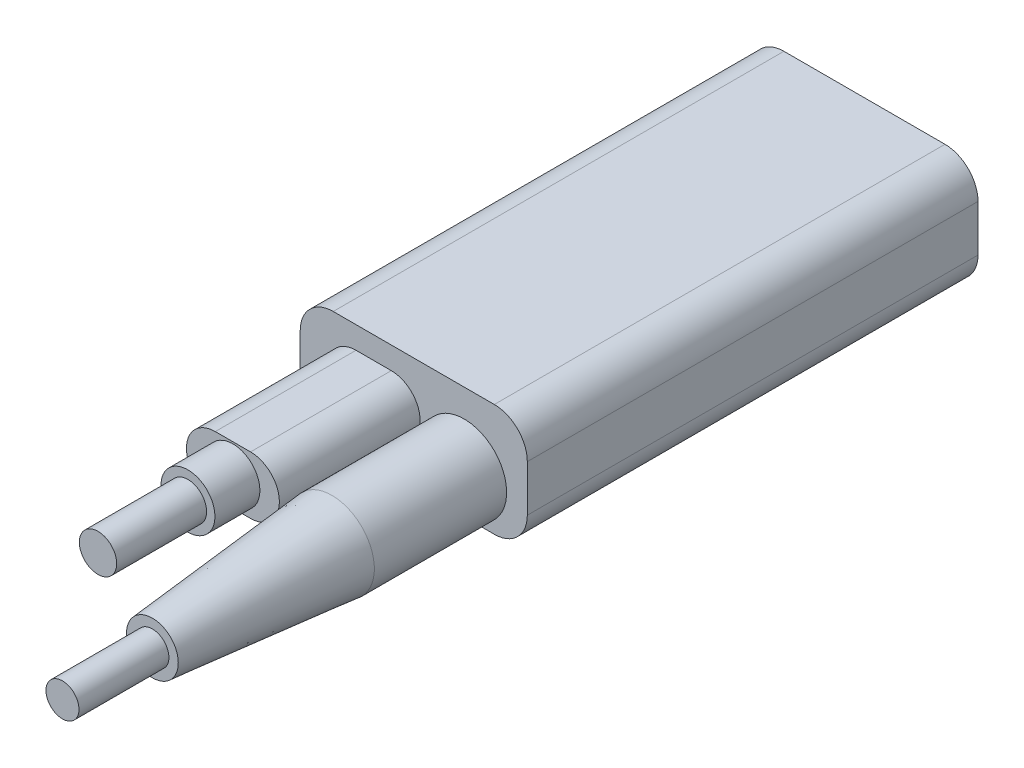
ISO-10303-21;
HEADER;
FILE_DESCRIPTION(('STEP AP214'),'2;1');
FILE_NAME('part.step','',(''),(''),'','','');
FILE_SCHEMA(('AUTOMOTIVE_DESIGN { 1 0 10303 214 1 1 1 1 }'));
ENDSEC;
DATA;
#1=APPLICATION_CONTEXT('core data for automotive mechanical design processes');
#2=APPLICATION_PROTOCOL_DEFINITION('international standard','automotive_design',2000,#1);
#3=PRODUCT_CONTEXT('',#1,'mechanical');
#4=PRODUCT('Part','Part','',(#3));
#5=PRODUCT_RELATED_PRODUCT_CATEGORY('part','',(#4));
#6=PRODUCT_DEFINITION_FORMATION('','',#4);
#7=PRODUCT_DEFINITION_CONTEXT('part definition',#1,'design');
#8=PRODUCT_DEFINITION('design','',#6,#7);
#9=PRODUCT_DEFINITION_SHAPE('','',#8);
#10=(LENGTH_UNIT() NAMED_UNIT(*) SI_UNIT(.MILLI.,.METRE.));
#11=(NAMED_UNIT(*) PLANE_ANGLE_UNIT() SI_UNIT($,.RADIAN.));
#12=(NAMED_UNIT(*) SI_UNIT($,.STERADIAN.) SOLID_ANGLE_UNIT());
#13=UNCERTAINTY_MEASURE_WITH_UNIT(LENGTH_MEASURE(1.E-05),#10,'distance_accuracy_value','');
#14=(GEOMETRIC_REPRESENTATION_CONTEXT(3) GLOBAL_UNCERTAINTY_ASSIGNED_CONTEXT((#13)) GLOBAL_UNIT_ASSIGNED_CONTEXT((#10,
#11,#12)) REPRESENTATION_CONTEXT('',''));
#15=CARTESIAN_POINT('',(0.,0.,0.));
#16=DIRECTION('',(0.,0.,1.));
#17=DIRECTION('',(1.,0.,0.));
#18=AXIS2_PLACEMENT_3D('',#15,#16,#17);
#19=CARTESIAN_POINT('',(0.,0.,25.055));
#20=DIRECTION('',(0.,0.,-1.));
#21=DIRECTION('',(-1.,0.,0.));
#22=AXIS2_PLACEMENT_3D('',#19,#20,#21);
#23=PLANE('',#22);
#24=DIRECTION('',(1.,0.,0.));
#25=VECTOR('',#24,1.);
#26=CARTESIAN_POINT('',(-12.625,-6.25,25.055));
#27=LINE('',#26,#25);
#28=CARTESIAN_POINT('',(5.61,-6.25,25.055));
#29=VERTEX_POINT('',#28);
#30=CARTESIAN_POINT('',(8.95500000000001,-6.25,25.055));
#31=VERTEX_POINT('',#30);
#32=EDGE_CURVE('E178',#29,#31,#27,.T.);
#33=ORIENTED_EDGE('',*,*,#32,.T.);
#34=CARTESIAN_POINT('',(8.95500000000001,-2.58,25.055));
#35=DIRECTION('',(0.,0.,-1.));
#36=DIRECTION('',(-1.,0.,0.));
#37=AXIS2_PLACEMENT_3D('',#34,#35,#36);
#38=CIRCLE('',#37,3.67);
#39=CARTESIAN_POINT('',(12.625,-2.58,25.055));
#40=VERTEX_POINT('',#39);
#41=EDGE_CURVE('E229',#31,#40,#38,.F.);
#42=ORIENTED_EDGE('',*,*,#41,.T.);
#43=DIRECTION('',(0.,1.,0.));
#44=VECTOR('',#43,1.);
#45=CARTESIAN_POINT('',(12.625,-6.25,25.055));
#46=LINE('',#45,#44);
#47=CARTESIAN_POINT('',(12.625,2.58,25.055));
#48=VERTEX_POINT('',#47);
#49=EDGE_CURVE('E201',#40,#48,#46,.T.);
#50=ORIENTED_EDGE('',*,*,#49,.T.);
#51=CARTESIAN_POINT('',(8.955,2.58,25.055));
#52=DIRECTION('',(0.,0.,-1.));
#53=DIRECTION('',(-1.,0.,0.));
#54=AXIS2_PLACEMENT_3D('',#51,#52,#53);
#55=CIRCLE('',#54,3.67);
#56=CARTESIAN_POINT('',(8.955,6.25,25.055));
#57=VERTEX_POINT('',#56);
#58=EDGE_CURVE('E227',#48,#57,#55,.F.);
#59=ORIENTED_EDGE('',*,*,#58,.T.);
#60=DIRECTION('',(-1.,0.,0.));
#61=VECTOR('',#60,1.);
#62=CARTESIAN_POINT('',(-12.625,6.25,25.055));
#63=LINE('',#62,#61);
#64=CARTESIAN_POINT('',(-8.955,6.25,25.055));
#65=VERTEX_POINT('',#64);
#66=EDGE_CURVE('E186',#57,#65,#63,.T.);
#67=ORIENTED_EDGE('',*,*,#66,.T.);
#68=CARTESIAN_POINT('',(-8.955,2.58,25.055));
#69=DIRECTION('',(0.,0.,-1.));
#70=DIRECTION('',(-1.,0.,0.));
#71=AXIS2_PLACEMENT_3D('',#68,#69,#70);
#72=CIRCLE('',#71,3.67);
#73=CARTESIAN_POINT('',(-12.625,2.58,25.055));
#74=VERTEX_POINT('',#73);
#75=EDGE_CURVE('E71',#65,#74,#72,.F.);
#76=ORIENTED_EDGE('',*,*,#75,.T.);
#77=DIRECTION('',(0.,-1.,0.));
#78=VECTOR('',#77,1.);
#79=CARTESIAN_POINT('',(-12.625,-6.25,25.055));
#80=LINE('',#79,#78);
#81=CARTESIAN_POINT('',(-12.625,-2.58,25.055));
#82=VERTEX_POINT('',#81);
#83=EDGE_CURVE('E185',#74,#82,#80,.T.);
#84=ORIENTED_EDGE('',*,*,#83,.T.);
#85=CARTESIAN_POINT('',(-8.955,-2.58,25.055));
#86=DIRECTION('',(0.,0.,-1.));
#87=DIRECTION('',(-1.,0.,0.));
#88=AXIS2_PLACEMENT_3D('',#85,#86,#87);
#89=CIRCLE('',#88,3.67);
#90=CARTESIAN_POINT('',(-8.955,-6.25,25.055));
#91=VERTEX_POINT('',#90);
#92=EDGE_CURVE('E173',#82,#91,#89,.F.);
#93=ORIENTED_EDGE('',*,*,#92,.T.);
#94=EDGE_CURVE('E166',#91,#29,#27,.T.);
#95=ORIENTED_EDGE('',*,*,#94,.T.);
#96=CARTESIAN_POINT('',(5.61,-1.535,25.055));
#97=DIRECTION('',(0.,0.,1.));
#98=DIRECTION('',(1.,0.,0.));
#99=AXIS2_PLACEMENT_3D('',#96,#97,#98);
#100=CIRCLE('',#99,4.715);
#101=EDGE_CURVE('E171',#29,#29,#100,.T.);
#102=ORIENTED_EDGE('',*,*,#101,.F.);
#103=EDGE_LOOP('',(#33,#42,#50,#59,#67,#76,#84,#93,#95,#102));
#104=FACE_BOUND('',#103,.T.);
#105=CARTESIAN_POINT('',(-6.42,0.575,25.055));
#106=DIRECTION('',(0.,0.,1.));
#107=DIRECTION('',(1.,0.,0.));
#108=AXIS2_PLACEMENT_3D('',#105,#106,#107);
#109=CIRCLE('',#108,3.205);
#110=CARTESIAN_POINT('',(-6.42,3.78,25.055));
#111=VERTEX_POINT('',#110);
#112=CARTESIAN_POINT('',(-6.42,-2.63,25.055));
#113=VERTEX_POINT('',#112);
#114=EDGE_CURVE('E205',#111,#113,#109,.T.);
#115=ORIENTED_EDGE('',*,*,#114,.F.);
#116=DIRECTION('',(-1.,0.,0.));
#117=VECTOR('',#116,1.);
#118=CARTESIAN_POINT('',(-6.42,3.78,25.055));
#119=LINE('',#118,#117);
#120=CARTESIAN_POINT('',(-2.5,3.78,25.055));
#121=VERTEX_POINT('',#120);
#122=EDGE_CURVE('E302',#121,#111,#119,.T.);
#123=ORIENTED_EDGE('',*,*,#122,.F.);
#124=CARTESIAN_POINT('',(-2.5,0.575,25.055));
#125=DIRECTION('',(0.,0.,1.));
#126=DIRECTION('',(1.,0.,0.));
#127=AXIS2_PLACEMENT_3D('',#124,#125,#126);
#128=CIRCLE('',#127,3.205);
#129=CARTESIAN_POINT('',(-2.5,-2.63,25.055));
#130=VERTEX_POINT('',#129);
#131=EDGE_CURVE('E306',#130,#121,#128,.T.);
#132=ORIENTED_EDGE('',*,*,#131,.F.);
#133=DIRECTION('',(1.,0.,0.));
#134=VECTOR('',#133,1.);
#135=CARTESIAN_POINT('',(-6.42,-2.63,25.055));
#136=LINE('',#135,#134);
#137=EDGE_CURVE('E309',#113,#130,#136,.T.);
#138=ORIENTED_EDGE('',*,*,#137,.F.);
#139=EDGE_LOOP('',(#115,#123,#132,#138));
#140=FACE_BOUND('',#139,.T.);
#141=ADVANCED_FACE('F51',(#104,#140),#23,.F.);
#142=CARTESIAN_POINT('',(12.625,-6.25,25.055));
#143=DIRECTION('',(-1.,0.,0.));
#144=DIRECTION('',(0.,0.,1.));
#145=AXIS2_PLACEMENT_3D('',#142,#143,#144);
#146=PLANE('',#145);
#147=ORIENTED_EDGE('',*,*,#49,.F.);
#148=DIRECTION('',(0.,0.,-1.));
#149=VECTOR('',#148,1.);
#150=CARTESIAN_POINT('',(12.625,-2.58,25.055));
#151=LINE('',#150,#149);
#152=CARTESIAN_POINT('',(12.625,-2.58,-25.055));
#153=VERTEX_POINT('',#152);
#154=EDGE_CURVE('E210',#40,#153,#151,.T.);
#155=ORIENTED_EDGE('',*,*,#154,.T.);
#156=DIRECTION('',(0.,1.,0.));
#157=VECTOR('',#156,1.);
#158=CARTESIAN_POINT('',(12.625,-6.25,-25.055));
#159=LINE('',#158,#157);
#160=CARTESIAN_POINT('',(12.625,2.58,-25.055));
#161=VERTEX_POINT('',#160);
#162=EDGE_CURVE('E190',#153,#161,#159,.T.);
#163=ORIENTED_EDGE('',*,*,#162,.T.);
#164=DIRECTION('',(0.,0.,-1.));
#165=VECTOR('',#164,1.);
#166=CARTESIAN_POINT('',(12.625,2.58,25.055));
#167=LINE('',#166,#165);
#168=EDGE_CURVE('E208',#161,#48,#167,.F.);
#169=ORIENTED_EDGE('',*,*,#168,.T.);
#170=EDGE_LOOP('',(#147,#155,#163,#169));
#171=FACE_BOUND('',#170,.T.);
#172=ADVANCED_FACE('F254',(#171),#146,.F.);
#173=CARTESIAN_POINT('',(-12.625,6.25,25.055));
#174=DIRECTION('',(0.,-1.,0.));
#175=DIRECTION('',(0.,0.,-1.));
#176=AXIS2_PLACEMENT_3D('',#173,#174,#175);
#177=PLANE('',#176);
#178=ORIENTED_EDGE('',*,*,#66,.F.);
#179=DIRECTION('',(0.,0.,-1.));
#180=VECTOR('',#179,1.);
#181=CARTESIAN_POINT('',(8.955,6.25,25.055));
#182=LINE('',#181,#180);
#183=CARTESIAN_POINT('',(8.955,6.25,-25.055));
#184=VERTEX_POINT('',#183);
#185=EDGE_CURVE('E233',#57,#184,#182,.T.);
#186=ORIENTED_EDGE('',*,*,#185,.T.);
#187=DIRECTION('',(-1.,0.,0.));
#188=VECTOR('',#187,1.);
#189=CARTESIAN_POINT('',(-12.625,6.25,-25.055));
#190=LINE('',#189,#188);
#191=CARTESIAN_POINT('',(-8.955,6.25,-25.055));
#192=VERTEX_POINT('',#191);
#193=EDGE_CURVE('E193',#184,#192,#190,.T.);
#194=ORIENTED_EDGE('',*,*,#193,.T.);
#195=DIRECTION('',(0.,0.,-1.));
#196=VECTOR('',#195,1.);
#197=CARTESIAN_POINT('',(-8.955,6.25,25.055));
#198=LINE('',#197,#196);
#199=EDGE_CURVE('E231',#192,#65,#198,.F.);
#200=ORIENTED_EDGE('',*,*,#199,.T.);
#201=EDGE_LOOP('',(#178,#186,#194,#200));
#202=FACE_BOUND('',#201,.T.);
#203=ADVANCED_FACE('F424',(#202),#177,.F.);
#204=CARTESIAN_POINT('',(-12.625,-6.25,25.055));
#205=DIRECTION('',(1.,0.,0.));
#206=DIRECTION('',(0.,0.,-1.));
#207=AXIS2_PLACEMENT_3D('',#204,#205,#206);
#208=PLANE('',#207);
#209=DIRECTION('',(0.,-1.,0.));
#210=VECTOR('',#209,1.);
#211=CARTESIAN_POINT('',(-12.625,-6.25,-25.055));
#212=LINE('',#211,#210);
#213=CARTESIAN_POINT('',(-12.625,2.58,-25.055));
#214=VERTEX_POINT('',#213);
#215=CARTESIAN_POINT('',(-12.625,-2.58,-25.055));
#216=VERTEX_POINT('',#215);
#217=EDGE_CURVE('E197',#214,#216,#212,.T.);
#218=ORIENTED_EDGE('',*,*,#217,.T.);
#219=DIRECTION('',(0.,0.,-1.));
#220=VECTOR('',#219,1.);
#221=CARTESIAN_POINT('',(-12.625,-2.58,25.055));
#222=LINE('',#221,#220);
#223=EDGE_CURVE('E14',#216,#82,#222,.F.);
#224=ORIENTED_EDGE('',*,*,#223,.T.);
#225=ORIENTED_EDGE('',*,*,#83,.F.);
#226=DIRECTION('',(0.,0.,-1.));
#227=VECTOR('',#226,1.);
#228=CARTESIAN_POINT('',(-12.625,2.58,25.055));
#229=LINE('',#228,#227);
#230=EDGE_CURVE('E59',#74,#214,#229,.T.);
#231=ORIENTED_EDGE('',*,*,#230,.T.);
#232=EDGE_LOOP('',(#218,#224,#225,#231));
#233=FACE_BOUND('',#232,.T.);
#234=ADVANCED_FACE('F238',(#233),#208,.F.);
#235=CARTESIAN_POINT('',(-12.625,-6.25,25.055));
#236=DIRECTION('',(0.,1.,0.));
#237=DIRECTION('',(0.,0.,1.));
#238=AXIS2_PLACEMENT_3D('',#235,#236,#237);
#239=PLANE('',#238);
#240=DIRECTION('',(1.,0.,0.));
#241=VECTOR('',#240,1.);
#242=CARTESIAN_POINT('',(-12.625,-6.25,-25.055));
#243=LINE('',#242,#241);
#244=CARTESIAN_POINT('',(-8.955,-6.25,-25.055));
#245=VERTEX_POINT('',#244);
#246=CARTESIAN_POINT('',(8.95500000000001,-6.25,-25.055));
#247=VERTEX_POINT('',#246);
#248=EDGE_CURVE('E199',#245,#247,#243,.T.);
#249=ORIENTED_EDGE('',*,*,#248,.T.);
#250=DIRECTION('',(0.,0.,-1.));
#251=VECTOR('',#250,1.);
#252=CARTESIAN_POINT('',(8.95500000000001,-6.25,25.055));
#253=LINE('',#252,#251);
#254=EDGE_CURVE('E183',#247,#31,#253,.F.);
#255=ORIENTED_EDGE('',*,*,#254,.T.);
#256=ORIENTED_EDGE('',*,*,#32,.F.);
#257=ORIENTED_EDGE('',*,*,#94,.F.);
#258=DIRECTION('',(0.,0.,-1.));
#259=VECTOR('',#258,1.);
#260=CARTESIAN_POINT('',(-8.955,-6.25,25.055));
#261=LINE('',#260,#259);
#262=EDGE_CURVE('E222',#91,#245,#261,.T.);
#263=ORIENTED_EDGE('',*,*,#262,.T.);
#264=EDGE_LOOP('',(#249,#255,#256,#257,#263));
#265=FACE_BOUND('',#264,.T.);
#266=ADVANCED_FACE('F181',(#265),#239,.F.);
#267=CARTESIAN_POINT('',(0.,0.,-25.055));
#268=DIRECTION('',(0.,0.,-1.));
#269=DIRECTION('',(-1.,0.,0.));
#270=AXIS2_PLACEMENT_3D('',#267,#268,#269);
#271=PLANE('',#270);
#272=DIRECTION('',(0.,1.,0.));
#273=VECTOR('',#272,1.);
#274=CARTESIAN_POINT('',(-7.25,-4.02,-25.055));
#275=LINE('',#274,#273);
#276=CARTESIAN_POINT('',(-7.25,-4.02,-25.055));
#277=VERTEX_POINT('',#276);
#278=CARTESIAN_POINT('',(-7.25,1.68,-25.055));
#279=VERTEX_POINT('',#278);
#280=EDGE_CURVE('E277',#277,#279,#275,.T.);
#281=ORIENTED_EDGE('',*,*,#280,.F.);
#282=DIRECTION('',(-1.,0.,0.));
#283=VECTOR('',#282,1.);
#284=CARTESIAN_POINT('',(7.25,-4.02,-25.055));
#285=LINE('',#284,#283);
#286=CARTESIAN_POINT('',(7.25,-4.02,-25.055));
#287=VERTEX_POINT('',#286);
#288=EDGE_CURVE('E267',#287,#277,#285,.T.);
#289=ORIENTED_EDGE('',*,*,#288,.F.);
#290=DIRECTION('',(0.,-1.,0.));
#291=VECTOR('',#290,1.);
#292=CARTESIAN_POINT('',(7.25,-4.02,-25.055));
#293=LINE('',#292,#291);
#294=CARTESIAN_POINT('',(7.25,1.68,-25.055));
#295=VERTEX_POINT('',#294);
#296=EDGE_CURVE('E271',#295,#287,#293,.T.);
#297=ORIENTED_EDGE('',*,*,#296,.F.);
#298=DIRECTION('',(1.,0.,0.));
#299=VECTOR('',#298,1.);
#300=CARTESIAN_POINT('',(7.25,1.68,-25.055));
#301=LINE('',#300,#299);
#302=EDGE_CURVE('E274',#279,#295,#301,.T.);
#303=ORIENTED_EDGE('',*,*,#302,.F.);
#304=EDGE_LOOP('',(#281,#289,#297,#303));
#305=FACE_BOUND('',#304,.T.);
#306=ORIENTED_EDGE('',*,*,#162,.F.);
#307=CARTESIAN_POINT('',(8.95500000000001,-2.58,-25.055));
#308=DIRECTION('',(0.,0.,-1.));
#309=DIRECTION('',(-1.,0.,0.));
#310=AXIS2_PLACEMENT_3D('',#307,#308,#309);
#311=CIRCLE('',#310,3.67);
#312=EDGE_CURVE('E220',#153,#247,#311,.T.);
#313=ORIENTED_EDGE('',*,*,#312,.T.);
#314=ORIENTED_EDGE('',*,*,#248,.F.);
#315=CARTESIAN_POINT('',(-8.955,-2.58,-25.055));
#316=DIRECTION('',(0.,0.,-1.));
#317=DIRECTION('',(-1.,0.,0.));
#318=AXIS2_PLACEMENT_3D('',#315,#316,#317);
#319=CIRCLE('',#318,3.67);
#320=EDGE_CURVE('E216',#245,#216,#319,.T.);
#321=ORIENTED_EDGE('',*,*,#320,.T.);
#322=ORIENTED_EDGE('',*,*,#217,.F.);
#323=CARTESIAN_POINT('',(-8.955,2.58,-25.055));
#324=DIRECTION('',(0.,0.,-1.));
#325=DIRECTION('',(-1.,0.,0.));
#326=AXIS2_PLACEMENT_3D('',#323,#324,#325);
#327=CIRCLE('',#326,3.67);
#328=EDGE_CURVE('E214',#214,#192,#327,.T.);
#329=ORIENTED_EDGE('',*,*,#328,.T.);
#330=ORIENTED_EDGE('',*,*,#193,.F.);
#331=CARTESIAN_POINT('',(8.955,2.58,-25.055));
#332=DIRECTION('',(0.,0.,-1.));
#333=DIRECTION('',(-1.,0.,0.));
#334=AXIS2_PLACEMENT_3D('',#331,#332,#333);
#335=CIRCLE('',#334,3.67);
#336=EDGE_CURVE('E218',#184,#161,#335,.T.);
#337=ORIENTED_EDGE('',*,*,#336,.T.);
#338=EDGE_LOOP('',(#306,#313,#314,#321,#322,#329,#330,#337));
#339=FACE_BOUND('',#338,.T.);
#340=ADVANCED_FACE('F242',(#305,#339),#271,.T.);
#341=CARTESIAN_POINT('',(-7.25,-4.02,-15.055));
#342=DIRECTION('',(-1.,0.,0.));
#343=DIRECTION('',(0.,0.,1.));
#344=AXIS2_PLACEMENT_3D('',#341,#342,#343);
#345=PLANE('',#344);
#346=ORIENTED_EDGE('',*,*,#280,.T.);
#347=DIRECTION('',(0.,0.,-1.));
#348=VECTOR('',#347,1.);
#349=CARTESIAN_POINT('',(-7.25,1.68,-15.055));
#350=LINE('',#349,#348);
#351=CARTESIAN_POINT('',(-7.25,1.68,-15.055));
#352=VERTEX_POINT('',#351);
#353=EDGE_CURVE('E258',#352,#279,#350,.T.);
#354=ORIENTED_EDGE('',*,*,#353,.F.);
#355=DIRECTION('',(0.,1.,0.));
#356=VECTOR('',#355,1.);
#357=CARTESIAN_POINT('',(-7.25,-4.02,-15.055));
#358=LINE('',#357,#356);
#359=CARTESIAN_POINT('',(-7.25,-4.02,-15.055));
#360=VERTEX_POINT('',#359);
#361=EDGE_CURVE('E270',#360,#352,#358,.T.);
#362=ORIENTED_EDGE('',*,*,#361,.F.);
#363=DIRECTION('',(0.,0.,-1.));
#364=VECTOR('',#363,1.);
#365=CARTESIAN_POINT('',(-7.25,-4.02,-15.055));
#366=LINE('',#365,#364);
#367=EDGE_CURVE('E194',#360,#277,#366,.T.);
#368=ORIENTED_EDGE('',*,*,#367,.T.);
#369=EDGE_LOOP('',(#346,#354,#362,#368));
#370=FACE_BOUND('',#369,.T.);
#371=ADVANCED_FACE('F428',(#370),#345,.F.);
#372=CARTESIAN_POINT('',(7.25,-4.02,-15.055));
#373=DIRECTION('',(0.,-1.,0.));
#374=DIRECTION('',(0.,0.,-1.));
#375=AXIS2_PLACEMENT_3D('',#372,#373,#374);
#376=PLANE('',#375);
#377=ORIENTED_EDGE('',*,*,#288,.T.);
#378=ORIENTED_EDGE('',*,*,#367,.F.);
#379=DIRECTION('',(-1.,0.,0.));
#380=VECTOR('',#379,1.);
#381=CARTESIAN_POINT('',(7.25,-4.02,-15.055));
#382=LINE('',#381,#380);
#383=CARTESIAN_POINT('',(7.25,-4.02,-15.055));
#384=VERTEX_POINT('',#383);
#385=EDGE_CURVE('E262',#384,#360,#382,.T.);
#386=ORIENTED_EDGE('',*,*,#385,.F.);
#387=DIRECTION('',(0.,0.,-1.));
#388=VECTOR('',#387,1.);
#389=CARTESIAN_POINT('',(7.25,-4.02,-15.055));
#390=LINE('',#389,#388);
#391=EDGE_CURVE('E264',#384,#287,#390,.T.);
#392=ORIENTED_EDGE('',*,*,#391,.T.);
#393=EDGE_LOOP('',(#377,#378,#386,#392));
#394=FACE_BOUND('',#393,.T.);
#395=ADVANCED_FACE('F635',(#394),#376,.F.);
#396=CARTESIAN_POINT('',(7.25,-4.02,-15.055));
#397=DIRECTION('',(1.,0.,0.));
#398=DIRECTION('',(0.,0.,-1.));
#399=AXIS2_PLACEMENT_3D('',#396,#397,#398);
#400=PLANE('',#399);
#401=ORIENTED_EDGE('',*,*,#296,.T.);
#402=ORIENTED_EDGE('',*,*,#391,.F.);
#403=DIRECTION('',(0.,-1.,0.));
#404=VECTOR('',#403,1.);
#405=CARTESIAN_POINT('',(7.25,-4.02,-15.055));
#406=LINE('',#405,#404);
#407=CARTESIAN_POINT('',(7.25,1.68,-15.055));
#408=VERTEX_POINT('',#407);
#409=EDGE_CURVE('E282',#408,#384,#406,.T.);
#410=ORIENTED_EDGE('',*,*,#409,.F.);
#411=DIRECTION('',(0.,0.,-1.));
#412=VECTOR('',#411,1.);
#413=CARTESIAN_POINT('',(7.25,1.68,-15.055));
#414=LINE('',#413,#412);
#415=EDGE_CURVE('E261',#408,#295,#414,.T.);
#416=ORIENTED_EDGE('',*,*,#415,.T.);
#417=EDGE_LOOP('',(#401,#402,#410,#416));
#418=FACE_BOUND('',#417,.T.);
#419=ADVANCED_FACE('F626',(#418),#400,.F.);
#420=CARTESIAN_POINT('',(7.25,1.68,-15.055));
#421=DIRECTION('',(0.,1.,0.));
#422=DIRECTION('',(0.,0.,1.));
#423=AXIS2_PLACEMENT_3D('',#420,#421,#422);
#424=PLANE('',#423);
#425=ORIENTED_EDGE('',*,*,#302,.T.);
#426=ORIENTED_EDGE('',*,*,#415,.F.);
#427=DIRECTION('',(1.,0.,0.));
#428=VECTOR('',#427,1.);
#429=CARTESIAN_POINT('',(7.25,1.68,-15.055));
#430=LINE('',#429,#428);
#431=EDGE_CURVE('E285',#352,#408,#430,.T.);
#432=ORIENTED_EDGE('',*,*,#431,.F.);
#433=ORIENTED_EDGE('',*,*,#353,.T.);
#434=EDGE_LOOP('',(#425,#426,#432,#433));
#435=FACE_BOUND('',#434,.T.);
#436=ADVANCED_FACE('F616',(#435),#424,.F.);
#437=CARTESIAN_POINT('',(0.,0.,-15.055));
#438=DIRECTION('',(0.,0.,1.));
#439=DIRECTION('',(1.,0.,0.));
#440=AXIS2_PLACEMENT_3D('',#437,#438,#439);
#441=PLANE('',#440);
#442=ORIENTED_EDGE('',*,*,#361,.T.);
#443=ORIENTED_EDGE('',*,*,#431,.T.);
#444=ORIENTED_EDGE('',*,*,#409,.T.);
#445=ORIENTED_EDGE('',*,*,#385,.T.);
#446=EDGE_LOOP('',(#442,#443,#444,#445));
#447=FACE_BOUND('',#446,.T.);
#448=ADVANCED_FACE('F608',(#447),#441,.F.);
#449=CARTESIAN_POINT('',(-6.42,0.575,40.705));
#450=DIRECTION('',(0.,0.,-1.));
#451=DIRECTION('',(-1.,0.,0.));
#452=AXIS2_PLACEMENT_3D('',#449,#450,#451);
#453=CYLINDRICAL_SURFACE('',#452,3.205);
#454=ORIENTED_EDGE('',*,*,#114,.T.);
#455=DIRECTION('',(0.,0.,-1.));
#456=VECTOR('',#455,1.);
#457=CARTESIAN_POINT('',(-6.42,-2.63,40.705));
#458=LINE('',#457,#456);
#459=CARTESIAN_POINT('',(-6.42,-2.63,40.705));
#460=VERTEX_POINT('',#459);
#461=EDGE_CURVE('E279',#460,#113,#458,.T.);
#462=ORIENTED_EDGE('',*,*,#461,.F.);
#463=CARTESIAN_POINT('',(-6.42,0.575,40.705));
#464=DIRECTION('',(0.,0.,1.));
#465=DIRECTION('',(1.,0.,0.));
#466=AXIS2_PLACEMENT_3D('',#463,#464,#465);
#467=CIRCLE('',#466,3.205);
#468=CARTESIAN_POINT('',(-6.42,3.78,40.705));
#469=VERTEX_POINT('',#468);
#470=EDGE_CURVE('E305',#469,#460,#467,.T.);
#471=ORIENTED_EDGE('',*,*,#470,.F.);
#472=DIRECTION('',(0.,0.,-1.));
#473=VECTOR('',#472,1.);
#474=CARTESIAN_POINT('',(-6.42,3.78,40.705));
#475=LINE('',#474,#473);
#476=EDGE_CURVE('E298',#469,#111,#475,.T.);
#477=ORIENTED_EDGE('',*,*,#476,.T.);
#478=EDGE_LOOP('',(#454,#462,#471,#477));
#479=FACE_BOUND('',#478,.T.);
#480=ADVANCED_FACE('F411',(#479),#453,.T.);
#481=CARTESIAN_POINT('',(-6.42,-2.63,40.705));
#482=DIRECTION('',(0.,1.,0.));
#483=DIRECTION('',(0.,0.,1.));
#484=AXIS2_PLACEMENT_3D('',#481,#482,#483);
#485=PLANE('',#484);
#486=ORIENTED_EDGE('',*,*,#137,.T.);
#487=DIRECTION('',(0.,0.,-1.));
#488=VECTOR('',#487,1.);
#489=CARTESIAN_POINT('',(-2.5,-2.63,40.705));
#490=LINE('',#489,#488);
#491=CARTESIAN_POINT('',(-2.5,-2.63,40.705));
#492=VERTEX_POINT('',#491);
#493=EDGE_CURVE('E292',#492,#130,#490,.T.);
#494=ORIENTED_EDGE('',*,*,#493,.F.);
#495=DIRECTION('',(1.,0.,0.));
#496=VECTOR('',#495,1.);
#497=CARTESIAN_POINT('',(-6.42,-2.63,40.705));
#498=LINE('',#497,#496);
#499=EDGE_CURVE('E317',#460,#492,#498,.T.);
#500=ORIENTED_EDGE('',*,*,#499,.F.);
#501=ORIENTED_EDGE('',*,*,#461,.T.);
#502=EDGE_LOOP('',(#486,#494,#500,#501));
#503=FACE_BOUND('',#502,.T.);
#504=ADVANCED_FACE('F413',(#503),#485,.F.);
#505=CARTESIAN_POINT('',(-2.5,0.575,40.705));
#506=DIRECTION('',(0.,0.,-1.));
#507=DIRECTION('',(-1.,0.,0.));
#508=AXIS2_PLACEMENT_3D('',#505,#506,#507);
#509=CYLINDRICAL_SURFACE('',#508,3.205);
#510=ORIENTED_EDGE('',*,*,#131,.T.);
#511=DIRECTION('',(0.,0.,-1.));
#512=VECTOR('',#511,1.);
#513=CARTESIAN_POINT('',(-2.5,3.78,40.705));
#514=LINE('',#513,#512);
#515=CARTESIAN_POINT('',(-2.5,3.78,40.705));
#516=VERTEX_POINT('',#515);
#517=EDGE_CURVE('E295',#516,#121,#514,.T.);
#518=ORIENTED_EDGE('',*,*,#517,.F.);
#519=CARTESIAN_POINT('',(-2.5,0.575,40.705));
#520=DIRECTION('',(0.,0.,1.));
#521=DIRECTION('',(1.,0.,0.));
#522=AXIS2_PLACEMENT_3D('',#519,#520,#521);
#523=CIRCLE('',#522,3.205);
#524=EDGE_CURVE('E315',#492,#516,#523,.T.);
#525=ORIENTED_EDGE('',*,*,#524,.F.);
#526=ORIENTED_EDGE('',*,*,#493,.T.);
#527=EDGE_LOOP('',(#510,#518,#525,#526));
#528=FACE_BOUND('',#527,.T.);
#529=ADVANCED_FACE('F417',(#528),#509,.T.);
#530=CARTESIAN_POINT('',(-6.42,3.78,40.705));
#531=DIRECTION('',(0.,-1.,0.));
#532=DIRECTION('',(0.,0.,-1.));
#533=AXIS2_PLACEMENT_3D('',#530,#531,#532);
#534=PLANE('',#533);
#535=ORIENTED_EDGE('',*,*,#122,.T.);
#536=ORIENTED_EDGE('',*,*,#476,.F.);
#537=DIRECTION('',(-1.,0.,0.));
#538=VECTOR('',#537,1.);
#539=CARTESIAN_POINT('',(-6.42,3.78,40.705));
#540=LINE('',#539,#538);
#541=EDGE_CURVE('E301',#516,#469,#540,.T.);
#542=ORIENTED_EDGE('',*,*,#541,.F.);
#543=ORIENTED_EDGE('',*,*,#517,.T.);
#544=EDGE_LOOP('',(#535,#536,#542,#543));
#545=FACE_BOUND('',#544,.T.);
#546=ADVANCED_FACE('F404',(#545),#534,.F.);
#547=CARTESIAN_POINT('',(-6.42,0.575,40.705));
#548=DIRECTION('',(0.,0.,1.));
#549=DIRECTION('',(1.,0.,0.));
#550=AXIS2_PLACEMENT_3D('',#547,#548,#549);
#551=PLANE('',#550);
#552=CARTESIAN_POINT('',(-4.46,0.575000000000001,40.705));
#553=DIRECTION('',(0.,0.,1.));
#554=DIRECTION('',(1.,0.,0.));
#555=AXIS2_PLACEMENT_3D('',#552,#553,#554);
#556=CIRCLE('',#555,3.);
#557=CARTESIAN_POINT('',(-1.46,0.575000000000001,40.705));
#558=VERTEX_POINT('',#557);
#559=EDGE_CURVE('E366',#558,#558,#556,.T.);
#560=ORIENTED_EDGE('',*,*,#559,.F.);
#561=EDGE_LOOP('',(#560));
#562=FACE_BOUND('',#561,.T.);
#563=ORIENTED_EDGE('',*,*,#470,.T.);
#564=ORIENTED_EDGE('',*,*,#499,.T.);
#565=ORIENTED_EDGE('',*,*,#524,.T.);
#566=ORIENTED_EDGE('',*,*,#541,.T.);
#567=EDGE_LOOP('',(#563,#564,#565,#566));
#568=FACE_BOUND('',#567,.T.);
#569=ADVANCED_FACE('F401',(#562,#568),#551,.T.);
#570=CARTESIAN_POINT('',(5.61,-1.535,39.765));
#571=DIRECTION('',(0.,0.,-1.));
#572=DIRECTION('',(-1.,0.,0.));
#573=AXIS2_PLACEMENT_3D('',#570,#571,#572);
#574=CYLINDRICAL_SURFACE('',#573,4.715);
#575=CARTESIAN_POINT('',(5.61,-1.535,39.765));
#576=DIRECTION('',(0.,0.,-1.));
#577=DIRECTION('',(-1.,0.,0.));
#578=AXIS2_PLACEMENT_3D('',#575,#576,#577);
#579=CIRCLE('',#578,4.715);
#580=CARTESIAN_POINT('',(0.895000000000003,-1.535,39.765));
#581=VERTEX_POINT('',#580);
#582=EDGE_CURVE('E202',#581,#581,#579,.F.);
#583=ORIENTED_EDGE('',*,*,#582,.F.);
#584=EDGE_LOOP('',(#583));
#585=FACE_BOUND('',#584,.T.);
#586=ORIENTED_EDGE('',*,*,#101,.T.);
#587=EDGE_LOOP('',(#586));
#588=FACE_BOUND('',#587,.T.);
#589=ADVANCED_FACE('F344',(#585,#588),#574,.T.);
#590=CARTESIAN_POINT('',(5.61,-1.535,59.725));
#591=DIRECTION('',(0.,0.,1.));
#592=DIRECTION('',(1.,0.,0.));
#593=AXIS2_PLACEMENT_3D('',#590,#591,#592);
#594=PLANE('',#593);
#595=CARTESIAN_POINT('',(5.61,-1.535,59.725));
#596=DIRECTION('',(0.,0.,1.));
#597=DIRECTION('',(1.,0.,0.));
#598=AXIS2_PLACEMENT_3D('',#595,#596,#597);
#599=CIRCLE('',#598,1.835);
#600=CARTESIAN_POINT('',(7.445,-1.535,59.725));
#601=VERTEX_POINT('',#600);
#602=EDGE_CURVE('E177',#601,#601,#599,.T.);
#603=ORIENTED_EDGE('',*,*,#602,.F.);
#604=EDGE_LOOP('',(#603));
#605=FACE_BOUND('',#604,.T.);
#606=CARTESIAN_POINT('',(5.61,-1.535,59.725));
#607=DIRECTION('',(0.,0.,1.));
#608=DIRECTION('',(1.,0.,0.));
#609=AXIS2_PLACEMENT_3D('',#606,#607,#608);
#610=CIRCLE('',#609,2.875);
#611=CARTESIAN_POINT('',(8.485,-1.535,59.725));
#612=VERTEX_POINT('',#611);
#613=EDGE_CURVE('E322',#612,#612,#610,.T.);
#614=ORIENTED_EDGE('',*,*,#613,.T.);
#615=EDGE_LOOP('',(#614));
#616=FACE_BOUND('',#615,.T.);
#617=ADVANCED_FACE('F333',(#605,#616),#594,.T.);
#618=CARTESIAN_POINT('',(5.61,-1.535,59.725));
#619=DIRECTION('',(0.,0.,-1.));
#620=DIRECTION('',(-1.,0.,0.));
#621=AXIS2_PLACEMENT_3D('',#618,#619,#620);
#622=CONICAL_SURFACE('',#621,2.875,0.0919245658399571);
#623=ORIENTED_EDGE('',*,*,#582,.T.);
#624=EDGE_LOOP('',(#623));
#625=FACE_BOUND('',#624,.T.);
#626=ORIENTED_EDGE('',*,*,#613,.F.);
#627=EDGE_LOOP('',(#626));
#628=FACE_BOUND('',#627,.T.);
#629=ADVANCED_FACE('F343',(#625,#628),#622,.T.);
#630=CARTESIAN_POINT('',(5.61,-1.535,69.725));
#631=DIRECTION('',(0.,0.,-1.));
#632=DIRECTION('',(-1.,0.,0.));
#633=AXIS2_PLACEMENT_3D('',#630,#631,#632);
#634=CYLINDRICAL_SURFACE('',#633,1.835);
#635=CARTESIAN_POINT('',(5.61,-1.535,69.725));
#636=DIRECTION('',(0.,0.,1.));
#637=DIRECTION('',(1.,0.,0.));
#638=AXIS2_PLACEMENT_3D('',#635,#636,#637);
#639=CIRCLE('',#638,1.835);
#640=CARTESIAN_POINT('',(7.445,-1.535,69.725));
#641=VERTEX_POINT('',#640);
#642=EDGE_CURVE('E327',#641,#641,#639,.T.);
#643=ORIENTED_EDGE('',*,*,#642,.F.);
#644=EDGE_LOOP('',(#643));
#645=FACE_BOUND('',#644,.T.);
#646=ORIENTED_EDGE('',*,*,#602,.T.);
#647=EDGE_LOOP('',(#646));
#648=FACE_BOUND('',#647,.T.);
#649=ADVANCED_FACE('F346',(#645,#648),#634,.T.);
#650=CARTESIAN_POINT('',(5.61,-1.535,69.725));
#651=DIRECTION('',(0.,0.,1.));
#652=DIRECTION('',(1.,0.,0.));
#653=AXIS2_PLACEMENT_3D('',#650,#651,#652);
#654=PLANE('',#653);
#655=ORIENTED_EDGE('',*,*,#642,.T.);
#656=EDGE_LOOP('',(#655));
#657=FACE_BOUND('',#656,.T.);
#658=ADVANCED_FACE('F397',(#657),#654,.T.);
#659=CARTESIAN_POINT('',(-4.46,0.575000000000001,45.705));
#660=DIRECTION('',(0.,0.,-1.));
#661=DIRECTION('',(-1.,0.,0.));
#662=AXIS2_PLACEMENT_3D('',#659,#660,#661);
#663=CYLINDRICAL_SURFACE('',#662,3.);
#664=CARTESIAN_POINT('',(-4.46,0.575000000000001,45.705));
#665=DIRECTION('',(0.,0.,1.));
#666=DIRECTION('',(1.,0.,0.));
#667=AXIS2_PLACEMENT_3D('',#664,#665,#666);
#668=CIRCLE('',#667,3.);
#669=CARTESIAN_POINT('',(-1.46,0.575000000000001,45.705));
#670=VERTEX_POINT('',#669);
#671=EDGE_CURVE('E369',#670,#670,#668,.T.);
#672=ORIENTED_EDGE('',*,*,#671,.F.);
#673=EDGE_LOOP('',(#672));
#674=FACE_BOUND('',#673,.T.);
#675=ORIENTED_EDGE('',*,*,#559,.T.);
#676=EDGE_LOOP('',(#675));
#677=FACE_BOUND('',#676,.T.);
#678=ADVANCED_FACE('F391',(#674,#677),#663,.T.);
#679=CARTESIAN_POINT('',(-4.46,0.575000000000001,45.705));
#680=DIRECTION('',(0.,0.,1.));
#681=DIRECTION('',(1.,0.,0.));
#682=AXIS2_PLACEMENT_3D('',#679,#680,#681);
#683=PLANE('',#682);
#684=CARTESIAN_POINT('',(-4.46,0.575000000000001,45.705));
#685=DIRECTION('',(0.,0.,1.));
#686=DIRECTION('',(1.,0.,0.));
#687=AXIS2_PLACEMENT_3D('',#684,#685,#686);
#688=CIRCLE('',#687,2.075);
#689=CARTESIAN_POINT('',(-2.385,0.575000000000001,45.705));
#690=VERTEX_POINT('',#689);
#691=EDGE_CURVE('E211',#690,#690,#688,.T.);
#692=ORIENTED_EDGE('',*,*,#691,.F.);
#693=EDGE_LOOP('',(#692));
#694=FACE_BOUND('',#693,.T.);
#695=ORIENTED_EDGE('',*,*,#671,.T.);
#696=EDGE_LOOP('',(#695));
#697=FACE_BOUND('',#696,.T.);
#698=ADVANCED_FACE('F385',(#694,#697),#683,.T.);
#699=CARTESIAN_POINT('',(-4.46,0.575000000000001,55.705));
#700=DIRECTION('',(0.,0.,-1.));
#701=DIRECTION('',(-1.,0.,0.));
#702=AXIS2_PLACEMENT_3D('',#699,#700,#701);
#703=CYLINDRICAL_SURFACE('',#702,2.075);
#704=CARTESIAN_POINT('',(-4.46,0.575000000000001,55.705));
#705=DIRECTION('',(0.,0.,1.));
#706=DIRECTION('',(1.,0.,0.));
#707=AXIS2_PLACEMENT_3D('',#704,#705,#706);
#708=CIRCLE('',#707,2.075);
#709=CARTESIAN_POINT('',(-2.385,0.575000000000001,55.705));
#710=VERTEX_POINT('',#709);
#711=EDGE_CURVE('E374',#710,#710,#708,.T.);
#712=ORIENTED_EDGE('',*,*,#711,.F.);
#713=EDGE_LOOP('',(#712));
#714=FACE_BOUND('',#713,.T.);
#715=ORIENTED_EDGE('',*,*,#691,.T.);
#716=EDGE_LOOP('',(#715));
#717=FACE_BOUND('',#716,.T.);
#718=ADVANCED_FACE('F382',(#714,#717),#703,.T.);
#719=CARTESIAN_POINT('',(-4.46,0.575000000000001,55.705));
#720=DIRECTION('',(0.,0.,1.));
#721=DIRECTION('',(1.,0.,0.));
#722=AXIS2_PLACEMENT_3D('',#719,#720,#721);
#723=PLANE('',#722);
#724=ORIENTED_EDGE('',*,*,#711,.T.);
#725=EDGE_LOOP('',(#724));
#726=FACE_BOUND('',#725,.T.);
#727=ADVANCED_FACE('F380',(#726),#723,.T.);
#728=CARTESIAN_POINT('',(8.95500000000001,-2.58,25.055));
#729=DIRECTION('',(0.,0.,-1.));
#730=DIRECTION('',(-1.,0.,0.));
#731=AXIS2_PLACEMENT_3D('',#728,#729,#730);
#732=CYLINDRICAL_SURFACE('',#731,3.67);
#733=ORIENTED_EDGE('',*,*,#41,.F.);
#734=ORIENTED_EDGE('',*,*,#254,.F.);
#735=ORIENTED_EDGE('',*,*,#312,.F.);
#736=ORIENTED_EDGE('',*,*,#154,.F.);
#737=EDGE_LOOP('',(#733,#734,#735,#736));
#738=FACE_BOUND('',#737,.T.);
#739=ADVANCED_FACE('F248',(#738),#732,.T.);
#740=CARTESIAN_POINT('',(8.955,2.58,25.055));
#741=DIRECTION('',(0.,0.,-1.));
#742=DIRECTION('',(-1.,0.,0.));
#743=AXIS2_PLACEMENT_3D('',#740,#741,#742);
#744=CYLINDRICAL_SURFACE('',#743,3.67);
#745=ORIENTED_EDGE('',*,*,#58,.F.);
#746=ORIENTED_EDGE('',*,*,#168,.F.);
#747=ORIENTED_EDGE('',*,*,#336,.F.);
#748=ORIENTED_EDGE('',*,*,#185,.F.);
#749=EDGE_LOOP('',(#745,#746,#747,#748));
#750=FACE_BOUND('',#749,.T.);
#751=ADVANCED_FACE('F442',(#750),#744,.T.);
#752=CARTESIAN_POINT('',(-8.955,-2.58,25.055));
#753=DIRECTION('',(0.,0.,-1.));
#754=DIRECTION('',(-1.,0.,0.));
#755=AXIS2_PLACEMENT_3D('',#752,#753,#754);
#756=CYLINDRICAL_SURFACE('',#755,3.67);
#757=ORIENTED_EDGE('',*,*,#92,.F.);
#758=ORIENTED_EDGE('',*,*,#223,.F.);
#759=ORIENTED_EDGE('',*,*,#320,.F.);
#760=ORIENTED_EDGE('',*,*,#262,.F.);
#761=EDGE_LOOP('',(#757,#758,#759,#760));
#762=FACE_BOUND('',#761,.T.);
#763=ADVANCED_FACE('F246',(#762),#756,.T.);
#764=CARTESIAN_POINT('',(-8.955,2.58,25.055));
#765=DIRECTION('',(0.,0.,-1.));
#766=DIRECTION('',(-1.,0.,0.));
#767=AXIS2_PLACEMENT_3D('',#764,#765,#766);
#768=CYLINDRICAL_SURFACE('',#767,3.67);
#769=ORIENTED_EDGE('',*,*,#75,.F.);
#770=ORIENTED_EDGE('',*,*,#199,.F.);
#771=ORIENTED_EDGE('',*,*,#328,.F.);
#772=ORIENTED_EDGE('',*,*,#230,.F.);
#773=EDGE_LOOP('',(#769,#770,#771,#772));
#774=FACE_BOUND('',#773,.T.);
#775=ADVANCED_FACE('F53',(#774),#768,.T.);
#776=CLOSED_SHELL('',(#141,#172,#203,#234,#266,#340,#371,#395,#419,#436,#448,#480,#504,#529,
#546,#569,#589,#617,#629,#649,#658,#678,#698,#718,#727,#739,#751,#763,#775));
#777=MANIFOLD_SOLID_BREP('B2',#776);
#778=ADVANCED_BREP_SHAPE_REPRESENTATION('',(#18,#777),#14);
#779=SHAPE_DEFINITION_REPRESENTATION(#9,#778);
ENDSEC;
END-ISO-10303-21;
